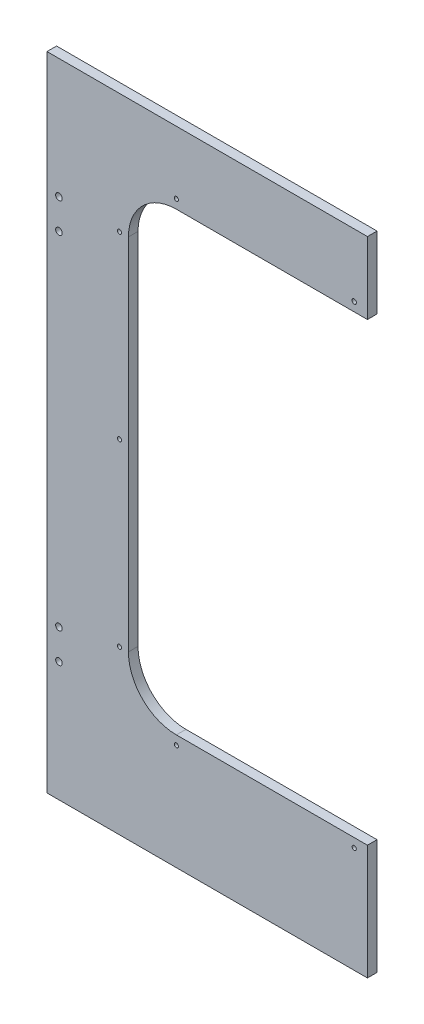
ISO-10303-21;
HEADER;
FILE_DESCRIPTION(('STEP AP214'),'2;1');
FILE_NAME('part.step','',(''),(''),'','','');
FILE_SCHEMA(('AUTOMOTIVE_DESIGN { 1 0 10303 214 1 1 1 1 }'));
ENDSEC;
DATA;
#1=APPLICATION_CONTEXT('core data for automotive mechanical design processes');
#2=APPLICATION_PROTOCOL_DEFINITION('international standard','automotive_design',2000,#1);
#3=PRODUCT_CONTEXT('',#1,'mechanical');
#4=PRODUCT('Part','Part','',(#3));
#5=PRODUCT_RELATED_PRODUCT_CATEGORY('part','',(#4));
#6=PRODUCT_DEFINITION_FORMATION('','',#4);
#7=PRODUCT_DEFINITION_CONTEXT('part definition',#1,'design');
#8=PRODUCT_DEFINITION('design','',#6,#7);
#9=PRODUCT_DEFINITION_SHAPE('','',#8);
#10=(LENGTH_UNIT() NAMED_UNIT(*) SI_UNIT(.MILLI.,.METRE.));
#11=(NAMED_UNIT(*) PLANE_ANGLE_UNIT() SI_UNIT($,.RADIAN.));
#12=(NAMED_UNIT(*) SI_UNIT($,.STERADIAN.) SOLID_ANGLE_UNIT());
#13=UNCERTAINTY_MEASURE_WITH_UNIT(LENGTH_MEASURE(1.E-05),#10,'distance_accuracy_value','');
#14=(GEOMETRIC_REPRESENTATION_CONTEXT(3) GLOBAL_UNCERTAINTY_ASSIGNED_CONTEXT((#13)) GLOBAL_UNIT_ASSIGNED_CONTEXT((#10,
#11,#12)) REPRESENTATION_CONTEXT('',''));
#15=CARTESIAN_POINT('',(0.,0.,0.));
#16=DIRECTION('',(0.,0.,1.));
#17=DIRECTION('',(1.,0.,0.));
#18=AXIS2_PLACEMENT_3D('',#15,#16,#17);
#19=CARTESIAN_POINT('',(9.39703284870651E-13,-268.,8.));
#20=DIRECTION('',(-1.,0.,0.));
#21=DIRECTION('',(0.,-1.,0.));
#22=AXIS2_PLACEMENT_3D('',#19,#20,#21);
#23=PLANE('',#22);
#24=DIRECTION('',(0.,1.,0.));
#25=VECTOR('',#24,1.);
#26=CARTESIAN_POINT('',(9.39703284870651E-13,-268.,8.));
#27=LINE('',#26,#25);
#28=CARTESIAN_POINT('',(0.,208.,8.));
#29=VERTEX_POINT('',#28);
#30=CARTESIAN_POINT('',(-9.39703284870702E-13,268.,8.));
#31=VERTEX_POINT('',#30);
#32=EDGE_CURVE('E201',#29,#31,#27,.T.);
#33=ORIENTED_EDGE('',*,*,#32,.F.);
#34=DIRECTION('',(0.,0.,-1.));
#35=VECTOR('',#34,1.);
#36=CARTESIAN_POINT('',(-7.29321952436969E-13,208.,8.));
#37=LINE('',#36,#35);
#38=CARTESIAN_POINT('',(0.,208.,0.));
#39=VERTEX_POINT('',#38);
#40=EDGE_CURVE('E11',#29,#39,#37,.T.);
#41=ORIENTED_EDGE('',*,*,#40,.T.);
#42=DIRECTION('',(0.,1.,0.));
#43=VECTOR('',#42,1.);
#44=CARTESIAN_POINT('',(9.39703284870651E-13,-268.,0.));
#45=LINE('',#44,#43);
#46=CARTESIAN_POINT('',(-9.39703284870702E-13,268.,0.));
#47=VERTEX_POINT('',#46);
#48=EDGE_CURVE('E211',#39,#47,#45,.T.);
#49=ORIENTED_EDGE('',*,*,#48,.T.);
#50=DIRECTION('',(0.,0.,-1.));
#51=VECTOR('',#50,1.);
#52=CARTESIAN_POINT('',(-9.39703284870702E-13,268.,8.));
#53=LINE('',#52,#51);
#54=EDGE_CURVE('E216',#31,#47,#53,.T.);
#55=ORIENTED_EDGE('',*,*,#54,.F.);
#56=EDGE_LOOP('',(#33,#41,#49,#55));
#57=FACE_BOUND('',#56,.T.);
#58=ADVANCED_FACE('F33',(#57),#23,.F.);
#59=CARTESIAN_POINT('',(0.,0.,8.));
#60=DIRECTION('',(0.,0.,1.));
#61=DIRECTION('',(1.,0.,0.));
#62=AXIS2_PLACEMENT_3D('',#59,#60,#61);
#63=PLANE('',#62);
#64=CARTESIAN_POINT('',(-11.0587719064732,-179.5,8.));
#65=DIRECTION('',(0.,0.,1.));
#66=DIRECTION('',(1.,0.,0.));
#67=AXIS2_PLACEMENT_3D('',#64,#65,#66);
#68=CIRCLE('',#67,1.74999999999991);
#69=CARTESIAN_POINT('',(-9.30877190647328,-179.5,8.));
#70=VERTEX_POINT('',#69);
#71=EDGE_CURVE('E253',#70,#70,#68,.T.);
#72=ORIENTED_EDGE('',*,*,#71,.F.);
#73=EDGE_LOOP('',(#72));
#74=FACE_BOUND('',#73,.T.);
#75=CARTESIAN_POINT('',(-159.5,-179.5,8.));
#76=DIRECTION('',(0.,0.,1.));
#77=DIRECTION('',(1.,0.,0.));
#78=AXIS2_PLACEMENT_3D('',#75,#76,#77);
#79=CIRCLE('',#78,1.7499999999999);
#80=CARTESIAN_POINT('',(-157.75,-179.5,8.));
#81=VERTEX_POINT('',#80);
#82=EDGE_CURVE('E243',#81,#81,#79,.T.);
#83=ORIENTED_EDGE('',*,*,#82,.F.);
#84=EDGE_LOOP('',(#83));
#85=FACE_BOUND('',#84,.T.);
#86=CARTESIAN_POINT('',(-207.,-132.,8.));
#87=DIRECTION('',(0.,0.,1.));
#88=DIRECTION('',(1.,0.,0.));
#89=AXIS2_PLACEMENT_3D('',#86,#87,#88);
#90=CIRCLE('',#89,1.74999999999992);
#91=CARTESIAN_POINT('',(-205.25,-132.,8.));
#92=VERTEX_POINT('',#91);
#93=EDGE_CURVE('E240',#92,#92,#90,.T.);
#94=ORIENTED_EDGE('',*,*,#93,.F.);
#95=EDGE_LOOP('',(#94));
#96=FACE_BOUND('',#95,.T.);
#97=CARTESIAN_POINT('',(-207.,18.0000000000003,8.));
#98=DIRECTION('',(0.,0.,1.));
#99=DIRECTION('',(1.,0.,0.));
#100=AXIS2_PLACEMENT_3D('',#97,#98,#99);
#101=CIRCLE('',#100,1.74999999999992);
#102=CARTESIAN_POINT('',(-205.25,18.0000000000003,8.));
#103=VERTEX_POINT('',#102);
#104=EDGE_CURVE('E237',#103,#103,#101,.T.);
#105=ORIENTED_EDGE('',*,*,#104,.F.);
#106=EDGE_LOOP('',(#105));
#107=FACE_BOUND('',#106,.T.);
#108=CARTESIAN_POINT('',(-207.,168.,8.));
#109=DIRECTION('',(0.,0.,1.));
#110=DIRECTION('',(1.,0.,0.));
#111=AXIS2_PLACEMENT_3D('',#108,#109,#110);
#112=CIRCLE('',#111,1.74999999999992);
#113=CARTESIAN_POINT('',(-205.25,168.,8.));
#114=VERTEX_POINT('',#113);
#115=EDGE_CURVE('E233',#114,#114,#112,.T.);
#116=ORIENTED_EDGE('',*,*,#115,.F.);
#117=EDGE_LOOP('',(#116));
#118=FACE_BOUND('',#117,.T.);
#119=CARTESIAN_POINT('',(-159.5,215.5,8.));
#120=DIRECTION('',(0.,0.,1.));
#121=DIRECTION('',(1.,0.,0.));
#122=AXIS2_PLACEMENT_3D('',#119,#120,#121);
#123=CIRCLE('',#122,1.74999999999992);
#124=CARTESIAN_POINT('',(-157.75,215.5,8.));
#125=VERTEX_POINT('',#124);
#126=EDGE_CURVE('E229',#125,#125,#123,.T.);
#127=ORIENTED_EDGE('',*,*,#126,.F.);
#128=EDGE_LOOP('',(#127));
#129=FACE_BOUND('',#128,.T.);
#130=CARTESIAN_POINT('',(-11.0587719064732,215.5,8.));
#131=DIRECTION('',(0.,0.,1.));
#132=DIRECTION('',(1.,0.,0.));
#133=AXIS2_PLACEMENT_3D('',#130,#131,#132);
#134=CIRCLE('',#133,1.8642712906092);
#135=CARTESIAN_POINT('',(-9.19450061586399,215.5,8.));
#136=VERTEX_POINT('',#135);
#137=EDGE_CURVE('E152',#136,#136,#134,.T.);
#138=ORIENTED_EDGE('',*,*,#137,.F.);
#139=EDGE_LOOP('',(#138));
#140=FACE_BOUND('',#139,.T.);
#141=DIRECTION('',(-1.,0.,0.));
#142=VECTOR('',#141,1.);
#143=CARTESIAN_POINT('',(-159.5,208.,8.));
#144=LINE('',#143,#142);
#145=CARTESIAN_POINT('',(-159.5,208.,8.));
#146=VERTEX_POINT('',#145);
#147=EDGE_CURVE('E163',#29,#146,#144,.T.);
#148=ORIENTED_EDGE('',*,*,#147,.F.);
#149=ORIENTED_EDGE('',*,*,#32,.T.);
#150=DIRECTION('',(-1.,0.,0.));
#151=VECTOR('',#150,1.);
#152=CARTESIAN_POINT('',(-267.5,268.,8.));
#153=LINE('',#152,#151);
#154=CARTESIAN_POINT('',(-267.5,268.,8.));
#155=VERTEX_POINT('',#154);
#156=EDGE_CURVE('E59',#31,#155,#153,.T.);
#157=ORIENTED_EDGE('',*,*,#156,.T.);
#158=DIRECTION('',(0.,-1.,0.));
#159=VECTOR('',#158,1.);
#160=CARTESIAN_POINT('',(-267.5,268.,8.));
#161=LINE('',#160,#159);
#162=CARTESIAN_POINT('',(-267.5,-268.,8.));
#163=VERTEX_POINT('',#162);
#164=EDGE_CURVE('E198',#155,#163,#161,.T.);
#165=ORIENTED_EDGE('',*,*,#164,.T.);
#166=DIRECTION('',(1.,0.,0.));
#167=VECTOR('',#166,1.);
#168=CARTESIAN_POINT('',(-267.5,-268.,8.));
#169=LINE('',#168,#167);
#170=CARTESIAN_POINT('',(9.39703284870651E-13,-268.,8.));
#171=VERTEX_POINT('',#170);
#172=EDGE_CURVE('E88',#163,#171,#169,.T.);
#173=ORIENTED_EDGE('',*,*,#172,.T.);
#174=CARTESIAN_POINT('',(6.03093152976676E-13,-172.,8.));
#175=VERTEX_POINT('',#174);
#176=EDGE_CURVE('E202',#171,#175,#27,.T.);
#177=ORIENTED_EDGE('',*,*,#176,.T.);
#178=DIRECTION('',(1.,0.,0.));
#179=VECTOR('',#178,1.);
#180=CARTESIAN_POINT('',(-159.5,-172.,8.));
#181=LINE('',#180,#179);
#182=CARTESIAN_POINT('',(-159.5,-172.,8.));
#183=VERTEX_POINT('',#182);
#184=EDGE_CURVE('E50',#183,#175,#181,.T.);
#185=ORIENTED_EDGE('',*,*,#184,.F.);
#186=CARTESIAN_POINT('',(-159.5,-132.,8.));
#187=DIRECTION('',(0.,0.,1.));
#188=DIRECTION('',(1.,0.,0.));
#189=AXIS2_PLACEMENT_3D('',#186,#187,#188);
#190=CIRCLE('',#189,40.);
#191=CARTESIAN_POINT('',(-199.5,-132.,8.));
#192=VERTEX_POINT('',#191);
#193=EDGE_CURVE('E129',#192,#183,#190,.T.);
#194=ORIENTED_EDGE('',*,*,#193,.F.);
#195=DIRECTION('',(0.,-1.,0.));
#196=VECTOR('',#195,1.);
#197=CARTESIAN_POINT('',(-199.5,168.,8.));
#198=LINE('',#197,#196);
#199=CARTESIAN_POINT('',(-199.5,168.,8.));
#200=VERTEX_POINT('',#199);
#201=EDGE_CURVE('E146',#200,#192,#198,.T.);
#202=ORIENTED_EDGE('',*,*,#201,.F.);
#203=CARTESIAN_POINT('',(-159.5,168.,8.));
#204=DIRECTION('',(0.,0.,1.));
#205=DIRECTION('',(1.,0.,0.));
#206=AXIS2_PLACEMENT_3D('',#203,#204,#205);
#207=CIRCLE('',#206,40.);
#208=EDGE_CURVE('E149',#146,#200,#207,.T.);
#209=ORIENTED_EDGE('',*,*,#208,.F.);
#210=EDGE_LOOP('',(#148,#149,#157,#165,#173,#177,#185,#194,#202,#209));
#211=FACE_BOUND('',#210,.T.);
#212=CARTESIAN_POINT('',(-257.50934142313,143.000001745244,8.));
#213=DIRECTION('',(0.,0.,1.));
#214=DIRECTION('',(-1.,0.,0.));
#215=AXIS2_PLACEMENT_3D('',#212,#213,#214);
#216=CIRCLE('',#215,2.74999999999998);
#217=CARTESIAN_POINT('',(-260.25934142313,143.000001745244,8.));
#218=VERTEX_POINT('',#217);
#219=EDGE_CURVE('E180',#218,#218,#216,.T.);
#220=ORIENTED_EDGE('',*,*,#219,.F.);
#221=EDGE_LOOP('',(#220));
#222=FACE_BOUND('',#221,.T.);
#223=CARTESIAN_POINT('',(-257.50934142313,-143.000001745244,8.));
#224=DIRECTION('',(0.,0.,1.));
#225=DIRECTION('',(1.,0.,0.));
#226=AXIS2_PLACEMENT_3D('',#223,#224,#225);
#227=CIRCLE('',#226,2.74999999999998);
#228=CARTESIAN_POINT('',(-254.75934142313,-143.000001745244,8.));
#229=VERTEX_POINT('',#228);
#230=EDGE_CURVE('E192',#229,#229,#227,.T.);
#231=ORIENTED_EDGE('',*,*,#230,.F.);
#232=EDGE_LOOP('',(#231));
#233=FACE_BOUND('',#232,.T.);
#234=CARTESIAN_POINT('',(-257.499999999992,168.,8.));
#235=DIRECTION('',(0.,0.,1.));
#236=DIRECTION('',(-1.,0.,0.));
#237=AXIS2_PLACEMENT_3D('',#234,#235,#236);
#238=CIRCLE('',#237,2.74999999999998);
#239=CARTESIAN_POINT('',(-260.249999999992,168.,8.));
#240=VERTEX_POINT('',#239);
#241=EDGE_CURVE('E186',#240,#240,#238,.T.);
#242=ORIENTED_EDGE('',*,*,#241,.F.);
#243=EDGE_LOOP('',(#242));
#244=FACE_BOUND('',#243,.T.);
#245=CARTESIAN_POINT('',(-257.499999999992,-168.,8.));
#246=DIRECTION('',(0.,0.,1.));
#247=DIRECTION('',(1.,0.,0.));
#248=AXIS2_PLACEMENT_3D('',#245,#246,#247);
#249=CIRCLE('',#248,2.74999999999998);
#250=CARTESIAN_POINT('',(-254.749999999992,-168.,8.));
#251=VERTEX_POINT('',#250);
#252=EDGE_CURVE('E174',#251,#251,#249,.T.);
#253=ORIENTED_EDGE('',*,*,#252,.F.);
#254=EDGE_LOOP('',(#253));
#255=FACE_BOUND('',#254,.T.);
#256=ADVANCED_FACE('F265',(#74,#85,#96,#107,#118,#129,#140,#211,#222,#233,#244,#255),#63,.T.);
#257=CARTESIAN_POINT('',(0.,0.,0.));
#258=DIRECTION('',(0.,0.,1.));
#259=DIRECTION('',(1.,0.,0.));
#260=AXIS2_PLACEMENT_3D('',#257,#258,#259);
#261=PLANE('',#260);
#262=CARTESIAN_POINT('',(-11.0587719064732,-179.5,0.));
#263=DIRECTION('',(0.,0.,1.));
#264=DIRECTION('',(1.,0.,0.));
#265=AXIS2_PLACEMENT_3D('',#262,#263,#264);
#266=CIRCLE('',#265,1.74999999999991);
#267=CARTESIAN_POINT('',(-9.30877190647328,-179.5,0.));
#268=VERTEX_POINT('',#267);
#269=EDGE_CURVE('E37',#268,#268,#266,.T.);
#270=ORIENTED_EDGE('',*,*,#269,.T.);
#271=EDGE_LOOP('',(#270));
#272=FACE_BOUND('',#271,.T.);
#273=CARTESIAN_POINT('',(-159.5,-179.5,0.));
#274=DIRECTION('',(0.,0.,1.));
#275=DIRECTION('',(1.,0.,0.));
#276=AXIS2_PLACEMENT_3D('',#273,#274,#275);
#277=CIRCLE('',#276,1.7499999999999);
#278=CARTESIAN_POINT('',(-157.75,-179.5,0.));
#279=VERTEX_POINT('',#278);
#280=EDGE_CURVE('E241',#279,#279,#277,.T.);
#281=ORIENTED_EDGE('',*,*,#280,.T.);
#282=EDGE_LOOP('',(#281));
#283=FACE_BOUND('',#282,.T.);
#284=CARTESIAN_POINT('',(-207.,-132.,0.));
#285=DIRECTION('',(0.,0.,1.));
#286=DIRECTION('',(1.,0.,0.));
#287=AXIS2_PLACEMENT_3D('',#284,#285,#286);
#288=CIRCLE('',#287,1.74999999999992);
#289=CARTESIAN_POINT('',(-205.25,-132.,0.));
#290=VERTEX_POINT('',#289);
#291=EDGE_CURVE('E238',#290,#290,#288,.T.);
#292=ORIENTED_EDGE('',*,*,#291,.T.);
#293=EDGE_LOOP('',(#292));
#294=FACE_BOUND('',#293,.T.);
#295=CARTESIAN_POINT('',(-207.,18.0000000000003,0.));
#296=DIRECTION('',(0.,0.,1.));
#297=DIRECTION('',(1.,0.,0.));
#298=AXIS2_PLACEMENT_3D('',#295,#296,#297);
#299=CIRCLE('',#298,1.74999999999992);
#300=CARTESIAN_POINT('',(-205.25,18.0000000000003,0.));
#301=VERTEX_POINT('',#300);
#302=EDGE_CURVE('E234',#301,#301,#299,.T.);
#303=ORIENTED_EDGE('',*,*,#302,.T.);
#304=EDGE_LOOP('',(#303));
#305=FACE_BOUND('',#304,.T.);
#306=CARTESIAN_POINT('',(-207.,168.,0.));
#307=DIRECTION('',(0.,0.,1.));
#308=DIRECTION('',(1.,0.,0.));
#309=AXIS2_PLACEMENT_3D('',#306,#307,#308);
#310=CIRCLE('',#309,1.74999999999992);
#311=CARTESIAN_POINT('',(-205.25,168.,0.));
#312=VERTEX_POINT('',#311);
#313=EDGE_CURVE('E230',#312,#312,#310,.T.);
#314=ORIENTED_EDGE('',*,*,#313,.T.);
#315=EDGE_LOOP('',(#314));
#316=FACE_BOUND('',#315,.T.);
#317=CARTESIAN_POINT('',(-159.5,215.5,0.));
#318=DIRECTION('',(0.,0.,1.));
#319=DIRECTION('',(1.,0.,0.));
#320=AXIS2_PLACEMENT_3D('',#317,#318,#319);
#321=CIRCLE('',#320,1.74999999999992);
#322=CARTESIAN_POINT('',(-157.75,215.5,0.));
#323=VERTEX_POINT('',#322);
#324=EDGE_CURVE('E226',#323,#323,#321,.T.);
#325=ORIENTED_EDGE('',*,*,#324,.T.);
#326=EDGE_LOOP('',(#325));
#327=FACE_BOUND('',#326,.T.);
#328=CARTESIAN_POINT('',(-11.0587719064732,215.5,0.));
#329=DIRECTION('',(0.,0.,1.));
#330=DIRECTION('',(1.,0.,0.));
#331=AXIS2_PLACEMENT_3D('',#328,#329,#330);
#332=CIRCLE('',#331,1.8642712906092);
#333=CARTESIAN_POINT('',(-9.19450061586399,215.5,0.));
#334=VERTEX_POINT('',#333);
#335=EDGE_CURVE('E161',#334,#334,#332,.T.);
#336=ORIENTED_EDGE('',*,*,#335,.T.);
#337=EDGE_LOOP('',(#336));
#338=FACE_BOUND('',#337,.T.);
#339=CARTESIAN_POINT('',(-257.50934142313,143.000001745244,0.));
#340=DIRECTION('',(0.,0.,1.));
#341=DIRECTION('',(-1.,0.,0.));
#342=AXIS2_PLACEMENT_3D('',#339,#340,#341);
#343=CIRCLE('',#342,2.74999999999998);
#344=CARTESIAN_POINT('',(-260.25934142313,143.000001745244,0.));
#345=VERTEX_POINT('',#344);
#346=EDGE_CURVE('E177',#345,#345,#343,.T.);
#347=ORIENTED_EDGE('',*,*,#346,.T.);
#348=EDGE_LOOP('',(#347));
#349=FACE_BOUND('',#348,.T.);
#350=CARTESIAN_POINT('',(-257.50934142313,-143.000001745244,0.));
#351=DIRECTION('',(0.,0.,1.));
#352=DIRECTION('',(1.,0.,0.));
#353=AXIS2_PLACEMENT_3D('',#350,#351,#352);
#354=CIRCLE('',#353,2.74999999999998);
#355=CARTESIAN_POINT('',(-254.75934142313,-143.000001745244,0.));
#356=VERTEX_POINT('',#355);
#357=EDGE_CURVE('E189',#356,#356,#354,.T.);
#358=ORIENTED_EDGE('',*,*,#357,.T.);
#359=EDGE_LOOP('',(#358));
#360=FACE_BOUND('',#359,.T.);
#361=ORIENTED_EDGE('',*,*,#48,.F.);
#362=DIRECTION('',(-1.,0.,0.));
#363=VECTOR('',#362,1.);
#364=CARTESIAN_POINT('',(-159.5,208.,0.));
#365=LINE('',#364,#363);
#366=CARTESIAN_POINT('',(-159.5,208.,0.));
#367=VERTEX_POINT('',#366);
#368=EDGE_CURVE('E139',#39,#367,#365,.T.);
#369=ORIENTED_EDGE('',*,*,#368,.T.);
#370=CARTESIAN_POINT('',(-159.5,168.,0.));
#371=DIRECTION('',(0.,0.,1.));
#372=DIRECTION('',(1.,0.,0.));
#373=AXIS2_PLACEMENT_3D('',#370,#371,#372);
#374=CIRCLE('',#373,40.);
#375=CARTESIAN_POINT('',(-199.5,168.,0.));
#376=VERTEX_POINT('',#375);
#377=EDGE_CURVE('E157',#367,#376,#374,.T.);
#378=ORIENTED_EDGE('',*,*,#377,.T.);
#379=DIRECTION('',(0.,-1.,0.));
#380=VECTOR('',#379,1.);
#381=CARTESIAN_POINT('',(-199.5,168.,0.));
#382=LINE('',#381,#380);
#383=CARTESIAN_POINT('',(-199.5,-132.,0.));
#384=VERTEX_POINT('',#383);
#385=EDGE_CURVE('E131',#376,#384,#382,.T.);
#386=ORIENTED_EDGE('',*,*,#385,.T.);
#387=CARTESIAN_POINT('',(-159.5,-132.,0.));
#388=DIRECTION('',(0.,0.,1.));
#389=DIRECTION('',(1.,0.,0.));
#390=AXIS2_PLACEMENT_3D('',#387,#388,#389);
#391=CIRCLE('',#390,40.);
#392=CARTESIAN_POINT('',(-159.5,-172.,0.));
#393=VERTEX_POINT('',#392);
#394=EDGE_CURVE('E126',#384,#393,#391,.T.);
#395=ORIENTED_EDGE('',*,*,#394,.T.);
#396=DIRECTION('',(1.,0.,0.));
#397=VECTOR('',#396,1.);
#398=CARTESIAN_POINT('',(-159.5,-172.,0.));
#399=LINE('',#398,#397);
#400=CARTESIAN_POINT('',(0.,-172.,0.));
#401=VERTEX_POINT('',#400);
#402=EDGE_CURVE('E134',#393,#401,#399,.T.);
#403=ORIENTED_EDGE('',*,*,#402,.T.);
#404=CARTESIAN_POINT('',(9.39703284870651E-13,-268.,0.));
#405=VERTEX_POINT('',#404);
#406=EDGE_CURVE('E212',#405,#401,#45,.T.);
#407=ORIENTED_EDGE('',*,*,#406,.F.);
#408=DIRECTION('',(1.,0.,0.));
#409=VECTOR('',#408,1.);
#410=CARTESIAN_POINT('',(-267.5,-268.,0.));
#411=LINE('',#410,#409);
#412=CARTESIAN_POINT('',(-267.5,-268.,0.));
#413=VERTEX_POINT('',#412);
#414=EDGE_CURVE('E209',#413,#405,#411,.T.);
#415=ORIENTED_EDGE('',*,*,#414,.F.);
#416=DIRECTION('',(0.,-1.,0.));
#417=VECTOR('',#416,1.);
#418=CARTESIAN_POINT('',(-267.5,268.,0.));
#419=LINE('',#418,#417);
#420=CARTESIAN_POINT('',(-267.5,268.,0.));
#421=VERTEX_POINT('',#420);
#422=EDGE_CURVE('E195',#421,#413,#419,.T.);
#423=ORIENTED_EDGE('',*,*,#422,.F.);
#424=DIRECTION('',(-1.,0.,0.));
#425=VECTOR('',#424,1.);
#426=CARTESIAN_POINT('',(-267.5,268.,0.));
#427=LINE('',#426,#425);
#428=EDGE_CURVE('E80',#47,#421,#427,.T.);
#429=ORIENTED_EDGE('',*,*,#428,.F.);
#430=EDGE_LOOP('',(#361,#369,#378,#386,#395,#403,#407,#415,#423,#429));
#431=FACE_BOUND('',#430,.T.);
#432=CARTESIAN_POINT('',(-257.499999999992,168.,0.));
#433=DIRECTION('',(0.,0.,1.));
#434=DIRECTION('',(-1.,0.,0.));
#435=AXIS2_PLACEMENT_3D('',#432,#433,#434);
#436=CIRCLE('',#435,2.74999999999998);
#437=CARTESIAN_POINT('',(-260.249999999992,168.,0.));
#438=VERTEX_POINT('',#437);
#439=EDGE_CURVE('E183',#438,#438,#436,.T.);
#440=ORIENTED_EDGE('',*,*,#439,.T.);
#441=EDGE_LOOP('',(#440));
#442=FACE_BOUND('',#441,.T.);
#443=CARTESIAN_POINT('',(-257.499999999992,-168.,0.));
#444=DIRECTION('',(0.,0.,1.));
#445=DIRECTION('',(1.,0.,0.));
#446=AXIS2_PLACEMENT_3D('',#443,#444,#445);
#447=CIRCLE('',#446,2.74999999999998);
#448=CARTESIAN_POINT('',(-254.749999999992,-168.,0.));
#449=VERTEX_POINT('',#448);
#450=EDGE_CURVE('E169',#449,#449,#447,.T.);
#451=ORIENTED_EDGE('',*,*,#450,.T.);
#452=EDGE_LOOP('',(#451));
#453=FACE_BOUND('',#452,.T.);
#454=ADVANCED_FACE('F142',(#272,#283,#294,#305,#316,#327,#338,#349,#360,#431,#442,#453),#261,.F.);
#455=CARTESIAN_POINT('',(-267.5,268.,8.));
#456=DIRECTION('',(1.,0.,0.));
#457=DIRECTION('',(0.,1.,0.));
#458=AXIS2_PLACEMENT_3D('',#455,#456,#457);
#459=PLANE('',#458);
#460=ORIENTED_EDGE('',*,*,#422,.T.);
#461=DIRECTION('',(0.,0.,-1.));
#462=VECTOR('',#461,1.);
#463=CARTESIAN_POINT('',(-267.5,-268.,8.));
#464=LINE('',#463,#462);
#465=EDGE_CURVE('E221',#163,#413,#464,.T.);
#466=ORIENTED_EDGE('',*,*,#465,.F.);
#467=ORIENTED_EDGE('',*,*,#164,.F.);
#468=DIRECTION('',(0.,0.,-1.));
#469=VECTOR('',#468,1.);
#470=CARTESIAN_POINT('',(-267.5,268.,8.));
#471=LINE('',#470,#469);
#472=EDGE_CURVE('E206',#155,#421,#471,.T.);
#473=ORIENTED_EDGE('',*,*,#472,.T.);
#474=EDGE_LOOP('',(#460,#466,#467,#473));
#475=FACE_BOUND('',#474,.T.);
#476=ADVANCED_FACE('F35',(#475),#459,.F.);
#477=CARTESIAN_POINT('',(-267.5,-268.,8.));
#478=DIRECTION('',(0.,1.,0.));
#479=DIRECTION('',(-1.,0.,0.));
#480=AXIS2_PLACEMENT_3D('',#477,#478,#479);
#481=PLANE('',#480);
#482=ORIENTED_EDGE('',*,*,#414,.T.);
#483=DIRECTION('',(0.,0.,-1.));
#484=VECTOR('',#483,1.);
#485=CARTESIAN_POINT('',(9.39703284870651E-13,-268.,8.));
#486=LINE('',#485,#484);
#487=EDGE_CURVE('E218',#171,#405,#486,.T.);
#488=ORIENTED_EDGE('',*,*,#487,.F.);
#489=ORIENTED_EDGE('',*,*,#172,.F.);
#490=ORIENTED_EDGE('',*,*,#465,.T.);
#491=EDGE_LOOP('',(#482,#488,#489,#490));
#492=FACE_BOUND('',#491,.T.);
#493=ADVANCED_FACE('F298',(#492),#481,.F.);
#494=ORIENTED_EDGE('',*,*,#406,.T.);
#495=DIRECTION('',(0.,0.,1.));
#496=VECTOR('',#495,1.);
#497=CARTESIAN_POINT('',(6.03093152976676E-13,-172.,8.));
#498=LINE('',#497,#496);
#499=EDGE_CURVE('E42',#401,#175,#498,.T.);
#500=ORIENTED_EDGE('',*,*,#499,.T.);
#501=ORIENTED_EDGE('',*,*,#176,.F.);
#502=ORIENTED_EDGE('',*,*,#487,.T.);
#503=EDGE_LOOP('',(#494,#500,#501,#502));
#504=FACE_BOUND('',#503,.T.);
#505=ADVANCED_FACE('F304',(#504),#23,.F.);
#506=CARTESIAN_POINT('',(-267.5,268.,8.));
#507=DIRECTION('',(0.,-1.,0.));
#508=DIRECTION('',(1.,0.,0.));
#509=AXIS2_PLACEMENT_3D('',#506,#507,#508);
#510=PLANE('',#509);
#511=ORIENTED_EDGE('',*,*,#428,.T.);
#512=ORIENTED_EDGE('',*,*,#472,.F.);
#513=ORIENTED_EDGE('',*,*,#156,.F.);
#514=ORIENTED_EDGE('',*,*,#54,.T.);
#515=EDGE_LOOP('',(#511,#512,#513,#514));
#516=FACE_BOUND('',#515,.T.);
#517=ADVANCED_FACE('F308',(#516),#510,.F.);
#518=CARTESIAN_POINT('',(-257.50934142313,-143.000001745244,8.));
#519=DIRECTION('',(0.,0.,-1.));
#520=DIRECTION('',(-1.,0.,0.));
#521=AXIS2_PLACEMENT_3D('',#518,#519,#520);
#522=CYLINDRICAL_SURFACE('',#521,2.74999999999998);
#523=ORIENTED_EDGE('',*,*,#230,.T.);
#524=EDGE_LOOP('',(#523));
#525=FACE_BOUND('',#524,.T.);
#526=ORIENTED_EDGE('',*,*,#357,.F.);
#527=EDGE_LOOP('',(#526));
#528=FACE_BOUND('',#527,.T.);
#529=ADVANCED_FACE('F314',(#525,#528),#522,.F.);
#530=CARTESIAN_POINT('',(-257.499999999992,168.,8.));
#531=DIRECTION('',(0.,0.,-1.));
#532=DIRECTION('',(-1.,0.,0.));
#533=AXIS2_PLACEMENT_3D('',#530,#531,#532);
#534=CYLINDRICAL_SURFACE('',#533,2.74999999999998);
#535=ORIENTED_EDGE('',*,*,#241,.T.);
#536=EDGE_LOOP('',(#535));
#537=FACE_BOUND('',#536,.T.);
#538=ORIENTED_EDGE('',*,*,#439,.F.);
#539=EDGE_LOOP('',(#538));
#540=FACE_BOUND('',#539,.T.);
#541=ADVANCED_FACE('F345',(#537,#540),#534,.F.);
#542=CARTESIAN_POINT('',(-257.50934142313,143.000001745244,8.));
#543=DIRECTION('',(0.,0.,-1.));
#544=DIRECTION('',(-1.,0.,0.));
#545=AXIS2_PLACEMENT_3D('',#542,#543,#544);
#546=CYLINDRICAL_SURFACE('',#545,2.74999999999998);
#547=ORIENTED_EDGE('',*,*,#219,.T.);
#548=EDGE_LOOP('',(#547));
#549=FACE_BOUND('',#548,.T.);
#550=ORIENTED_EDGE('',*,*,#346,.F.);
#551=EDGE_LOOP('',(#550));
#552=FACE_BOUND('',#551,.T.);
#553=ADVANCED_FACE('F288',(#549,#552),#546,.F.);
#554=CARTESIAN_POINT('',(-257.499999999992,-168.,8.));
#555=DIRECTION('',(0.,0.,-1.));
#556=DIRECTION('',(-1.,0.,0.));
#557=AXIS2_PLACEMENT_3D('',#554,#555,#556);
#558=CYLINDRICAL_SURFACE('',#557,2.74999999999998);
#559=ORIENTED_EDGE('',*,*,#252,.T.);
#560=EDGE_LOOP('',(#559));
#561=FACE_BOUND('',#560,.T.);
#562=ORIENTED_EDGE('',*,*,#450,.F.);
#563=EDGE_LOOP('',(#562));
#564=FACE_BOUND('',#563,.T.);
#565=ADVANCED_FACE('F284',(#561,#564),#558,.F.);
#566=CARTESIAN_POINT('',(-159.5,208.,0.));
#567=DIRECTION('',(0.,1.,0.));
#568=DIRECTION('',(0.,0.,1.));
#569=AXIS2_PLACEMENT_3D('',#566,#567,#568);
#570=PLANE('',#569);
#571=ORIENTED_EDGE('',*,*,#147,.T.);
#572=DIRECTION('',(0.,0.,1.));
#573=VECTOR('',#572,1.);
#574=CARTESIAN_POINT('',(-159.5,208.,0.));
#575=LINE('',#574,#573);
#576=EDGE_CURVE('E130',#367,#146,#575,.T.);
#577=ORIENTED_EDGE('',*,*,#576,.F.);
#578=ORIENTED_EDGE('',*,*,#368,.F.);
#579=ORIENTED_EDGE('',*,*,#40,.F.);
#580=EDGE_LOOP('',(#571,#577,#578,#579));
#581=FACE_BOUND('',#580,.T.);
#582=ADVANCED_FACE('F287',(#581),#570,.F.);
#583=CARTESIAN_POINT('',(-159.5,-172.,0.));
#584=DIRECTION('',(0.,-1.,0.));
#585=DIRECTION('',(1.,0.,0.));
#586=AXIS2_PLACEMENT_3D('',#583,#584,#585);
#587=PLANE('',#586);
#588=ORIENTED_EDGE('',*,*,#402,.F.);
#589=DIRECTION('',(0.,0.,1.));
#590=VECTOR('',#589,1.);
#591=CARTESIAN_POINT('',(-159.5,-172.,0.));
#592=LINE('',#591,#590);
#593=EDGE_CURVE('E122',#393,#183,#592,.T.);
#594=ORIENTED_EDGE('',*,*,#593,.T.);
#595=ORIENTED_EDGE('',*,*,#184,.T.);
#596=ORIENTED_EDGE('',*,*,#499,.F.);
#597=EDGE_LOOP('',(#588,#594,#595,#596));
#598=FACE_BOUND('',#597,.T.);
#599=ADVANCED_FACE('F135',(#598),#587,.F.);
#600=CARTESIAN_POINT('',(-159.5,-132.,0.));
#601=DIRECTION('',(0.,0.,1.));
#602=DIRECTION('',(1.,0.,0.));
#603=AXIS2_PLACEMENT_3D('',#600,#601,#602);
#604=CYLINDRICAL_SURFACE('',#603,40.);
#605=ORIENTED_EDGE('',*,*,#193,.T.);
#606=ORIENTED_EDGE('',*,*,#593,.F.);
#607=ORIENTED_EDGE('',*,*,#394,.F.);
#608=DIRECTION('',(0.,0.,1.));
#609=VECTOR('',#608,1.);
#610=CARTESIAN_POINT('',(-199.5,-132.,0.));
#611=LINE('',#610,#609);
#612=EDGE_CURVE('E167',#384,#192,#611,.T.);
#613=ORIENTED_EDGE('',*,*,#612,.T.);
#614=EDGE_LOOP('',(#605,#606,#607,#613));
#615=FACE_BOUND('',#614,.T.);
#616=ADVANCED_FACE('F124',(#615),#604,.F.);
#617=CARTESIAN_POINT('',(-199.5,168.,0.));
#618=DIRECTION('',(-1.,0.,0.));
#619=DIRECTION('',(0.,-1.,0.));
#620=AXIS2_PLACEMENT_3D('',#617,#618,#619);
#621=PLANE('',#620);
#622=ORIENTED_EDGE('',*,*,#201,.T.);
#623=ORIENTED_EDGE('',*,*,#612,.F.);
#624=ORIENTED_EDGE('',*,*,#385,.F.);
#625=DIRECTION('',(0.,0.,1.));
#626=VECTOR('',#625,1.);
#627=CARTESIAN_POINT('',(-199.5,168.,0.));
#628=LINE('',#627,#626);
#629=EDGE_CURVE('E170',#376,#200,#628,.T.);
#630=ORIENTED_EDGE('',*,*,#629,.T.);
#631=EDGE_LOOP('',(#622,#623,#624,#630));
#632=FACE_BOUND('',#631,.T.);
#633=ADVANCED_FACE('F326',(#632),#621,.F.);
#634=CARTESIAN_POINT('',(-159.5,168.,0.));
#635=DIRECTION('',(0.,0.,1.));
#636=DIRECTION('',(1.,0.,0.));
#637=AXIS2_PLACEMENT_3D('',#634,#635,#636);
#638=CYLINDRICAL_SURFACE('',#637,40.);
#639=ORIENTED_EDGE('',*,*,#208,.T.);
#640=ORIENTED_EDGE('',*,*,#629,.F.);
#641=ORIENTED_EDGE('',*,*,#377,.F.);
#642=ORIENTED_EDGE('',*,*,#576,.T.);
#643=EDGE_LOOP('',(#639,#640,#641,#642));
#644=FACE_BOUND('',#643,.T.);
#645=ADVANCED_FACE('F323',(#644),#638,.F.);
#646=CARTESIAN_POINT('',(-11.0587719064732,215.5,-2.));
#647=DIRECTION('',(0.,0.,1.));
#648=DIRECTION('',(1.,0.,0.));
#649=AXIS2_PLACEMENT_3D('',#646,#647,#648);
#650=CYLINDRICAL_SURFACE('',#649,1.8642712906092);
#651=ORIENTED_EDGE('',*,*,#137,.T.);
#652=EDGE_LOOP('',(#651));
#653=FACE_BOUND('',#652,.T.);
#654=ORIENTED_EDGE('',*,*,#335,.F.);
#655=EDGE_LOOP('',(#654));
#656=FACE_BOUND('',#655,.T.);
#657=ADVANCED_FACE('F333',(#653,#656),#650,.F.);
#658=CARTESIAN_POINT('',(-159.5,215.5,-2.));
#659=DIRECTION('',(0.,0.,1.));
#660=DIRECTION('',(1.,0.,0.));
#661=AXIS2_PLACEMENT_3D('',#658,#659,#660);
#662=CYLINDRICAL_SURFACE('',#661,1.74999999999992);
#663=ORIENTED_EDGE('',*,*,#126,.T.);
#664=EDGE_LOOP('',(#663));
#665=FACE_BOUND('',#664,.T.);
#666=ORIENTED_EDGE('',*,*,#324,.F.);
#667=EDGE_LOOP('',(#666));
#668=FACE_BOUND('',#667,.T.);
#669=ADVANCED_FACE('F262',(#665,#668),#662,.F.);
#670=CARTESIAN_POINT('',(-207.,168.,-2.));
#671=DIRECTION('',(0.,0.,1.));
#672=DIRECTION('',(1.,0.,0.));
#673=AXIS2_PLACEMENT_3D('',#670,#671,#672);
#674=CYLINDRICAL_SURFACE('',#673,1.74999999999992);
#675=ORIENTED_EDGE('',*,*,#115,.T.);
#676=EDGE_LOOP('',(#675));
#677=FACE_BOUND('',#676,.T.);
#678=ORIENTED_EDGE('',*,*,#313,.F.);
#679=EDGE_LOOP('',(#678));
#680=FACE_BOUND('',#679,.T.);
#681=ADVANCED_FACE('F421',(#677,#680),#674,.F.);
#682=CARTESIAN_POINT('',(-207.,18.0000000000003,-2.));
#683=DIRECTION('',(0.,0.,1.));
#684=DIRECTION('',(1.,0.,0.));
#685=AXIS2_PLACEMENT_3D('',#682,#683,#684);
#686=CYLINDRICAL_SURFACE('',#685,1.74999999999992);
#687=ORIENTED_EDGE('',*,*,#104,.T.);
#688=EDGE_LOOP('',(#687));
#689=FACE_BOUND('',#688,.T.);
#690=ORIENTED_EDGE('',*,*,#302,.F.);
#691=EDGE_LOOP('',(#690));
#692=FACE_BOUND('',#691,.T.);
#693=ADVANCED_FACE('F429',(#689,#692),#686,.F.);
#694=CARTESIAN_POINT('',(-207.,-132.,-2.));
#695=DIRECTION('',(0.,0.,1.));
#696=DIRECTION('',(1.,0.,0.));
#697=AXIS2_PLACEMENT_3D('',#694,#695,#696);
#698=CYLINDRICAL_SURFACE('',#697,1.74999999999992);
#699=ORIENTED_EDGE('',*,*,#93,.T.);
#700=EDGE_LOOP('',(#699));
#701=FACE_BOUND('',#700,.T.);
#702=ORIENTED_EDGE('',*,*,#291,.F.);
#703=EDGE_LOOP('',(#702));
#704=FACE_BOUND('',#703,.T.);
#705=ADVANCED_FACE('F439',(#701,#704),#698,.F.);
#706=CARTESIAN_POINT('',(-159.5,-179.5,-2.));
#707=DIRECTION('',(0.,0.,1.));
#708=DIRECTION('',(1.,0.,0.));
#709=AXIS2_PLACEMENT_3D('',#706,#707,#708);
#710=CYLINDRICAL_SURFACE('',#709,1.7499999999999);
#711=ORIENTED_EDGE('',*,*,#82,.T.);
#712=EDGE_LOOP('',(#711));
#713=FACE_BOUND('',#712,.T.);
#714=ORIENTED_EDGE('',*,*,#280,.F.);
#715=EDGE_LOOP('',(#714));
#716=FACE_BOUND('',#715,.T.);
#717=ADVANCED_FACE('F449',(#713,#716),#710,.F.);
#718=CARTESIAN_POINT('',(-11.0587719064732,-179.5,-2.));
#719=DIRECTION('',(0.,0.,1.));
#720=DIRECTION('',(1.,0.,0.));
#721=AXIS2_PLACEMENT_3D('',#718,#719,#720);
#722=CYLINDRICAL_SURFACE('',#721,1.74999999999991);
#723=ORIENTED_EDGE('',*,*,#71,.T.);
#724=EDGE_LOOP('',(#723));
#725=FACE_BOUND('',#724,.T.);
#726=ORIENTED_EDGE('',*,*,#269,.F.);
#727=EDGE_LOOP('',(#726));
#728=FACE_BOUND('',#727,.T.);
#729=ADVANCED_FACE('F459',(#725,#728),#722,.F.);
#730=CLOSED_SHELL('',(#58,#256,#454,#476,#493,#505,#517,#529,#541,#553,#565,#582,#599,#616,#633,
#645,#657,#669,#681,#693,#705,#717,#729));
#731=MANIFOLD_SOLID_BREP('B2',#730);
#732=ADVANCED_BREP_SHAPE_REPRESENTATION('',(#18,#731),#14);
#733=SHAPE_DEFINITION_REPRESENTATION(#9,#732);
ENDSEC;
END-ISO-10303-21;
